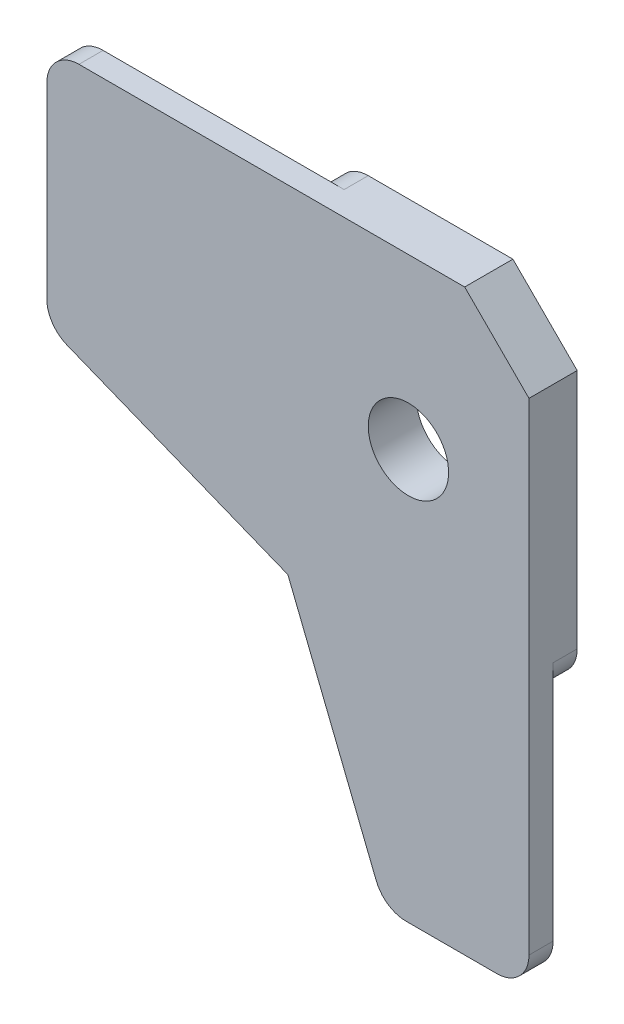
ISO-10303-21;
HEADER;
FILE_DESCRIPTION(('STEP AP214'),'2;1');
FILE_NAME('part.step','',(''),(''),'','','');
FILE_SCHEMA(('AUTOMOTIVE_DESIGN { 1 0 10303 214 1 1 1 1 }'));
ENDSEC;
DATA;
#1=APPLICATION_CONTEXT('core data for automotive mechanical design processes');
#2=APPLICATION_PROTOCOL_DEFINITION('international standard','automotive_design',2000,#1);
#3=PRODUCT_CONTEXT('',#1,'mechanical');
#4=PRODUCT('Part','Part','',(#3));
#5=PRODUCT_RELATED_PRODUCT_CATEGORY('part','',(#4));
#6=PRODUCT_DEFINITION_FORMATION('','',#4);
#7=PRODUCT_DEFINITION_CONTEXT('part definition',#1,'design');
#8=PRODUCT_DEFINITION('design','',#6,#7);
#9=PRODUCT_DEFINITION_SHAPE('','',#8);
#10=(LENGTH_UNIT() NAMED_UNIT(*) SI_UNIT(.MILLI.,.METRE.));
#11=(NAMED_UNIT(*) PLANE_ANGLE_UNIT() SI_UNIT($,.RADIAN.));
#12=(NAMED_UNIT(*) SI_UNIT($,.STERADIAN.) SOLID_ANGLE_UNIT());
#13=UNCERTAINTY_MEASURE_WITH_UNIT(LENGTH_MEASURE(1.E-05),#10,'distance_accuracy_value','');
#14=(GEOMETRIC_REPRESENTATION_CONTEXT(3) GLOBAL_UNCERTAINTY_ASSIGNED_CONTEXT((#13)) GLOBAL_UNIT_ASSIGNED_CONTEXT((#10,
#11,#12)) REPRESENTATION_CONTEXT('',''));
#15=CARTESIAN_POINT('',(0.,0.,0.));
#16=DIRECTION('',(0.,0.,1.));
#17=DIRECTION('',(1.,0.,0.));
#18=AXIS2_PLACEMENT_3D('',#15,#16,#17);
#19=CARTESIAN_POINT('',(0.,0.,-1.5));
#20=DIRECTION('',(1.,0.,0.));
#21=DIRECTION('',(0.,0.,1.));
#22=AXIS2_PLACEMENT_3D('',#19,#20,#21);
#23=PLANE('',#22);
#24=DIRECTION('',(0.,-1.,0.));
#25=VECTOR('',#24,1.);
#26=CARTESIAN_POINT('',(0.,0.,-1.5));
#27=LINE('',#26,#25);
#28=CARTESIAN_POINT('',(0.,19.,-1.5));
#29=VERTEX_POINT('',#28);
#30=CARTESIAN_POINT('',(0.,2.,-1.5));
#31=VERTEX_POINT('',#30);
#32=EDGE_CURVE('E220',#29,#31,#27,.T.);
#33=ORIENTED_EDGE('',*,*,#32,.T.);
#34=DIRECTION('',(0.,0.,1.));
#35=VECTOR('',#34,1.);
#36=CARTESIAN_POINT('',(0.,2.,-1.5));
#37=LINE('',#36,#35);
#38=CARTESIAN_POINT('',(0.,2.,0.));
#39=VERTEX_POINT('',#38);
#40=EDGE_CURVE('E287',#39,#31,#37,.F.);
#41=ORIENTED_EDGE('',*,*,#40,.F.);
#42=DIRECTION('',(0.,-1.,0.));
#43=VECTOR('',#42,1.);
#44=CARTESIAN_POINT('',(0.,0.,0.));
#45=LINE('',#44,#43);
#46=CARTESIAN_POINT('',(0.,19.,0.));
#47=VERTEX_POINT('',#46);
#48=EDGE_CURVE('E181',#47,#39,#45,.T.);
#49=ORIENTED_EDGE('',*,*,#48,.F.);
#50=DIRECTION('',(0.,0.,1.));
#51=VECTOR('',#50,1.);
#52=CARTESIAN_POINT('',(0.,19.,-1.5));
#53=LINE('',#52,#51);
#54=EDGE_CURVE('E289',#29,#47,#53,.T.);
#55=ORIENTED_EDGE('',*,*,#54,.F.);
#56=EDGE_LOOP('',(#33,#41,#49,#55));
#57=FACE_BOUND('',#56,.T.);
#58=ADVANCED_FACE('F41',(#57),#23,.F.);
#59=CARTESIAN_POINT('',(0.,0.,-1.5));
#60=DIRECTION('',(0.,1.,0.));
#61=DIRECTION('',(0.,0.,-1.));
#62=AXIS2_PLACEMENT_3D('',#59,#60,#61);
#63=PLANE('',#62);
#64=DIRECTION('',(1.,0.,0.));
#65=VECTOR('',#64,1.);
#66=CARTESIAN_POINT('',(0.,0.,0.));
#67=LINE('',#66,#65);
#68=CARTESIAN_POINT('',(2.,0.,0.));
#69=VERTEX_POINT('',#68);
#70=CARTESIAN_POINT('',(13.,0.,0.));
#71=VERTEX_POINT('',#70);
#72=EDGE_CURVE('E224',#69,#71,#67,.T.);
#73=ORIENTED_EDGE('',*,*,#72,.F.);
#74=DIRECTION('',(0.,0.,1.));
#75=VECTOR('',#74,1.);
#76=CARTESIAN_POINT('',(2.,0.,-1.5));
#77=LINE('',#76,#75);
#78=CARTESIAN_POINT('',(2.,0.,-1.5));
#79=VERTEX_POINT('',#78);
#80=EDGE_CURVE('E297',#79,#69,#77,.T.);
#81=ORIENTED_EDGE('',*,*,#80,.F.);
#82=DIRECTION('',(1.,0.,0.));
#83=VECTOR('',#82,1.);
#84=CARTESIAN_POINT('',(0.,0.,-1.5));
#85=LINE('',#84,#83);
#86=CARTESIAN_POINT('',(13.,0.,-1.5));
#87=VERTEX_POINT('',#86);
#88=EDGE_CURVE('E223',#79,#87,#85,.T.);
#89=ORIENTED_EDGE('',*,*,#88,.T.);
#90=DIRECTION('',(0.,0.,1.));
#91=VECTOR('',#90,1.);
#92=CARTESIAN_POINT('',(13.,0.,-1.5));
#93=LINE('',#92,#91);
#94=EDGE_CURVE('E299',#71,#87,#93,.F.);
#95=ORIENTED_EDGE('',*,*,#94,.F.);
#96=EDGE_LOOP('',(#73,#81,#89,#95));
#97=FACE_BOUND('',#96,.T.);
#98=ADVANCED_FACE('F310',(#97),#63,.F.);
#99=CARTESIAN_POINT('',(15.,0.,-1.5));
#100=DIRECTION('',(-1.,0.,0.));
#101=DIRECTION('',(0.,0.,-1.));
#102=AXIS2_PLACEMENT_3D('',#99,#100,#101);
#103=PLANE('',#102);
#104=DIRECTION('',(0.,-1.,0.));
#105=VECTOR('',#104,1.);
#106=CARTESIAN_POINT('',(15.,0.,0.));
#107=LINE('',#106,#105);
#108=CARTESIAN_POINT('',(15.,2.,0.));
#109=VERTEX_POINT('',#108);
#110=CARTESIAN_POINT('',(15.,-13.,0.));
#111=VERTEX_POINT('',#110);
#112=EDGE_CURVE('E191',#109,#111,#107,.T.);
#113=ORIENTED_EDGE('',*,*,#112,.F.);
#114=DIRECTION('',(0.,0.,1.));
#115=VECTOR('',#114,1.);
#116=CARTESIAN_POINT('',(15.,2.,-1.5));
#117=LINE('',#116,#115);
#118=CARTESIAN_POINT('',(15.,2.,-1.5));
#119=VERTEX_POINT('',#118);
#120=EDGE_CURVE('E255',#119,#109,#117,.T.);
#121=ORIENTED_EDGE('',*,*,#120,.F.);
#122=DIRECTION('',(0.,1.,0.));
#123=VECTOR('',#122,1.);
#124=CARTESIAN_POINT('',(15.,0.,-1.5));
#125=LINE('',#124,#123);
#126=CARTESIAN_POINT('',(15.,17.,-1.5));
#127=VERTEX_POINT('',#126);
#128=EDGE_CURVE('E227',#119,#127,#125,.T.);
#129=ORIENTED_EDGE('',*,*,#128,.T.);
#130=DIRECTION('',(0.,0.,1.));
#131=VECTOR('',#130,1.);
#132=CARTESIAN_POINT('',(15.,17.,-1.5));
#133=LINE('',#132,#131);
#134=CARTESIAN_POINT('',(15.,17.,1.5));
#135=VERTEX_POINT('',#134);
#136=EDGE_CURVE('E242',#127,#135,#133,.T.);
#137=ORIENTED_EDGE('',*,*,#136,.T.);
#138=DIRECTION('',(0.,-1.,0.));
#139=VECTOR('',#138,1.);
#140=CARTESIAN_POINT('',(15.,17.,1.5));
#141=LINE('',#140,#139);
#142=CARTESIAN_POINT('',(15.,-13.,1.5));
#143=VERTEX_POINT('',#142);
#144=EDGE_CURVE('E203',#135,#143,#141,.T.);
#145=ORIENTED_EDGE('',*,*,#144,.T.);
#146=DIRECTION('',(0.,0.,-1.));
#147=VECTOR('',#146,1.);
#148=CARTESIAN_POINT('',(15.,-13.,-1.5));
#149=LINE('',#148,#147);
#150=EDGE_CURVE('E258',#111,#143,#149,.F.);
#151=ORIENTED_EDGE('',*,*,#150,.F.);
#152=EDGE_LOOP('',(#113,#121,#129,#137,#145,#151));
#153=FACE_BOUND('',#152,.T.);
#154=ADVANCED_FACE('F337',(#153),#103,.F.);
#155=CARTESIAN_POINT('',(11.,21.,-1.5));
#156=DIRECTION('',(-0.707106781186547,-0.707106781186547,0.));
#157=DIRECTION('',(0.707106781186548,-0.707106781186548,0.));
#158=AXIS2_PLACEMENT_3D('',#155,#156,#157);
#159=PLANE('',#158);
#160=ORIENTED_EDGE('',*,*,#136,.F.);
#161=DIRECTION('',(-0.707106781186548,0.707106781186548,0.));
#162=VECTOR('',#161,1.);
#163=CARTESIAN_POINT('',(11.,21.,-1.5));
#164=LINE('',#163,#162);
#165=CARTESIAN_POINT('',(11.,21.,-1.5));
#166=VERTEX_POINT('',#165);
#167=EDGE_CURVE('E230',#127,#166,#164,.T.);
#168=ORIENTED_EDGE('',*,*,#167,.T.);
#169=DIRECTION('',(0.,0.,1.));
#170=VECTOR('',#169,1.);
#171=CARTESIAN_POINT('',(11.,21.,-1.5));
#172=LINE('',#171,#170);
#173=CARTESIAN_POINT('',(11.,21.,1.5));
#174=VERTEX_POINT('',#173);
#175=EDGE_CURVE('E236',#166,#174,#172,.T.);
#176=ORIENTED_EDGE('',*,*,#175,.T.);
#177=DIRECTION('',(0.707106781186548,-0.707106781186548,0.));
#178=VECTOR('',#177,1.);
#179=CARTESIAN_POINT('',(11.,21.,1.5));
#180=LINE('',#179,#178);
#181=EDGE_CURVE('E201',#174,#135,#180,.T.);
#182=ORIENTED_EDGE('',*,*,#181,.T.);
#183=EDGE_LOOP('',(#160,#168,#176,#182));
#184=FACE_BOUND('',#183,.T.);
#185=ADVANCED_FACE('F327',(#184),#159,.F.);
#186=CARTESIAN_POINT('',(0.,21.,-1.5));
#187=DIRECTION('',(0.,-1.,0.));
#188=DIRECTION('',(0.,0.,1.));
#189=AXIS2_PLACEMENT_3D('',#186,#187,#188);
#190=PLANE('',#189);
#191=DIRECTION('',(1.,0.,0.));
#192=VECTOR('',#191,1.);
#193=CARTESIAN_POINT('',(0.,21.,1.5));
#194=LINE('',#193,#192);
#195=CARTESIAN_POINT('',(-13.,21.,1.5));
#196=VERTEX_POINT('',#195);
#197=EDGE_CURVE('E199',#196,#174,#194,.T.);
#198=ORIENTED_EDGE('',*,*,#197,.T.);
#199=ORIENTED_EDGE('',*,*,#175,.F.);
#200=DIRECTION('',(-1.,0.,0.));
#201=VECTOR('',#200,1.);
#202=CARTESIAN_POINT('',(0.,21.,-1.5));
#203=LINE('',#202,#201);
#204=CARTESIAN_POINT('',(2.,21.,-1.5));
#205=VERTEX_POINT('',#204);
#206=EDGE_CURVE('E233',#166,#205,#203,.T.);
#207=ORIENTED_EDGE('',*,*,#206,.T.);
#208=DIRECTION('',(0.,0.,1.));
#209=VECTOR('',#208,1.);
#210=CARTESIAN_POINT('',(2.,21.,-1.5));
#211=LINE('',#210,#209);
#212=CARTESIAN_POINT('',(2.,21.,0.));
#213=VERTEX_POINT('',#212);
#214=EDGE_CURVE('E269',#213,#205,#211,.F.);
#215=ORIENTED_EDGE('',*,*,#214,.F.);
#216=DIRECTION('',(1.,0.,0.));
#217=VECTOR('',#216,1.);
#218=CARTESIAN_POINT('',(0.,21.,0.));
#219=LINE('',#218,#217);
#220=CARTESIAN_POINT('',(-13.,21.,0.));
#221=VERTEX_POINT('',#220);
#222=EDGE_CURVE('E215',#221,#213,#219,.T.);
#223=ORIENTED_EDGE('',*,*,#222,.F.);
#224=DIRECTION('',(0.,0.,-1.));
#225=VECTOR('',#224,1.);
#226=CARTESIAN_POINT('',(-13.,21.,-1.5));
#227=LINE('',#226,#225);
#228=EDGE_CURVE('E272',#196,#221,#227,.T.);
#229=ORIENTED_EDGE('',*,*,#228,.F.);
#230=EDGE_LOOP('',(#198,#199,#207,#215,#223,#229));
#231=FACE_BOUND('',#230,.T.);
#232=ADVANCED_FACE('F319',(#231),#190,.F.);
#233=CARTESIAN_POINT('',(0.,0.,-1.5));
#234=DIRECTION('',(0.,0.,1.));
#235=DIRECTION('',(-1.,0.,0.));
#236=AXIS2_PLACEMENT_3D('',#233,#234,#235);
#237=PLANE('',#236);
#238=CARTESIAN_POINT('',(7.5,10.5,-1.5));
#239=DIRECTION('',(0.,0.,-1.));
#240=DIRECTION('',(-1.,0.,0.));
#241=AXIS2_PLACEMENT_3D('',#238,#239,#240);
#242=CIRCLE('',#241,2.5);
#243=CARTESIAN_POINT('',(5.,10.5,-1.5));
#244=VERTEX_POINT('',#243);
#245=EDGE_CURVE('E210',#244,#244,#242,.T.);
#246=ORIENTED_EDGE('',*,*,#245,.F.);
#247=EDGE_LOOP('',(#246));
#248=FACE_BOUND('',#247,.T.);
#249=ORIENTED_EDGE('',*,*,#206,.F.);
#250=ORIENTED_EDGE('',*,*,#167,.F.);
#251=ORIENTED_EDGE('',*,*,#128,.F.);
#252=CARTESIAN_POINT('',(13.,2.,-1.5));
#253=DIRECTION('',(0.,0.,-1.));
#254=DIRECTION('',(-1.,0.,0.));
#255=AXIS2_PLACEMENT_3D('',#252,#253,#254);
#256=CIRCLE('',#255,2.);
#257=EDGE_CURVE('E62',#87,#119,#256,.F.);
#258=ORIENTED_EDGE('',*,*,#257,.F.);
#259=ORIENTED_EDGE('',*,*,#88,.F.);
#260=CARTESIAN_POINT('',(2.,2.,-1.5));
#261=DIRECTION('',(0.,0.,-1.));
#262=DIRECTION('',(-1.,0.,0.));
#263=AXIS2_PLACEMENT_3D('',#260,#261,#262);
#264=CIRCLE('',#263,2.);
#265=EDGE_CURVE('E292',#31,#79,#264,.F.);
#266=ORIENTED_EDGE('',*,*,#265,.F.);
#267=ORIENTED_EDGE('',*,*,#32,.F.);
#268=CARTESIAN_POINT('',(2.,19.,-1.5));
#269=DIRECTION('',(0.,0.,-1.));
#270=DIRECTION('',(-1.,0.,0.));
#271=AXIS2_PLACEMENT_3D('',#268,#269,#270);
#272=CIRCLE('',#271,2.);
#273=EDGE_CURVE('E295',#205,#29,#272,.F.);
#274=ORIENTED_EDGE('',*,*,#273,.F.);
#275=EDGE_LOOP('',(#249,#250,#251,#258,#259,#266,#267,#274));
#276=FACE_BOUND('',#275,.T.);
#277=ADVANCED_FACE('F316',(#248,#276),#237,.F.);
#278=CARTESIAN_POINT('',(0.,0.,1.5));
#279=DIRECTION('',(0.928476690885259,0.371390676354104,0.));
#280=DIRECTION('',(-0.371390676354104,0.928476690885259,0.));
#281=AXIS2_PLACEMENT_3D('',#278,#279,#280);
#282=PLANE('',#281);
#283=DIRECTION('',(-0.371390676354103,0.928476690885259,0.));
#284=VECTOR('',#283,1.);
#285=CARTESIAN_POINT('',(0.,0.,1.5));
#286=LINE('',#285,#284);
#287=CARTESIAN_POINT('',(5.49711254108328,-13.7427813527082,1.5));
#288=VERTEX_POINT('',#287);
#289=CARTESIAN_POINT('',(0.,0.,1.5));
#290=VERTEX_POINT('',#289);
#291=EDGE_CURVE('E165',#288,#290,#286,.T.);
#292=ORIENTED_EDGE('',*,*,#291,.T.);
#293=DIRECTION('',(0.,0.,-1.));
#294=VECTOR('',#293,1.);
#295=CARTESIAN_POINT('',(0.,0.,1.5));
#296=LINE('',#295,#294);
#297=CARTESIAN_POINT('',(0.,0.,0.));
#298=VERTEX_POINT('',#297);
#299=EDGE_CURVE('E174',#290,#298,#296,.T.);
#300=ORIENTED_EDGE('',*,*,#299,.T.);
#301=DIRECTION('',(-0.371390676354103,0.928476690885259,0.));
#302=VECTOR('',#301,1.);
#303=CARTESIAN_POINT('',(0.,0.,0.));
#304=LINE('',#303,#302);
#305=CARTESIAN_POINT('',(5.49711254108328,-13.7427813527082,0.));
#306=VERTEX_POINT('',#305);
#307=EDGE_CURVE('E208',#306,#298,#304,.T.);
#308=ORIENTED_EDGE('',*,*,#307,.F.);
#309=DIRECTION('',(0.,0.,-1.));
#310=VECTOR('',#309,1.);
#311=CARTESIAN_POINT('',(5.49711254108328,-13.7427813527082,1.5));
#312=LINE('',#311,#310);
#313=EDGE_CURVE('E187',#288,#306,#312,.T.);
#314=ORIENTED_EDGE('',*,*,#313,.F.);
#315=EDGE_LOOP('',(#292,#300,#308,#314));
#316=FACE_BOUND('',#315,.T.);
#317=ADVANCED_FACE('F185',(#316),#282,.F.);
#318=CARTESIAN_POINT('',(0.,0.,1.5));
#319=DIRECTION('',(0.371390676354104,0.928476690885259,0.));
#320=DIRECTION('',(-0.928476690885259,0.371390676354104,0.));
#321=AXIS2_PLACEMENT_3D('',#318,#319,#320);
#322=PLANE('',#321);
#323=DIRECTION('',(-0.928476690885259,0.371390676354104,0.));
#324=VECTOR('',#323,1.);
#325=CARTESIAN_POINT('',(0.,0.,0.));
#326=LINE('',#325,#324);
#327=CARTESIAN_POINT('',(-13.7427813527082,5.49711254108329,0.));
#328=VERTEX_POINT('',#327);
#329=EDGE_CURVE('E177',#298,#328,#326,.T.);
#330=ORIENTED_EDGE('',*,*,#329,.F.);
#331=ORIENTED_EDGE('',*,*,#299,.F.);
#332=DIRECTION('',(-0.928476690885259,0.371390676354104,0.));
#333=VECTOR('',#332,1.);
#334=CARTESIAN_POINT('',(0.,0.,1.5));
#335=LINE('',#334,#333);
#336=CARTESIAN_POINT('',(-13.7427813527082,5.49711254108329,1.5));
#337=VERTEX_POINT('',#336);
#338=EDGE_CURVE('E160',#290,#337,#335,.T.);
#339=ORIENTED_EDGE('',*,*,#338,.T.);
#340=DIRECTION('',(0.,0.,-1.));
#341=VECTOR('',#340,1.);
#342=CARTESIAN_POINT('',(-13.7427813527082,5.49711254108329,1.5));
#343=LINE('',#342,#341);
#344=EDGE_CURVE('E285',#328,#337,#343,.F.);
#345=ORIENTED_EDGE('',*,*,#344,.F.);
#346=EDGE_LOOP('',(#330,#331,#339,#345));
#347=FACE_BOUND('',#346,.T.);
#348=ADVANCED_FACE('F175',(#347),#322,.F.);
#349=CARTESIAN_POINT('',(-15.,21.,1.5));
#350=DIRECTION('',(1.,0.,0.));
#351=DIRECTION('',(0.,1.,0.));
#352=AXIS2_PLACEMENT_3D('',#349,#350,#351);
#353=PLANE('',#352);
#354=DIRECTION('',(0.,1.,0.));
#355=VECTOR('',#354,1.);
#356=CARTESIAN_POINT('',(-15.,21.,0.));
#357=LINE('',#356,#355);
#358=CARTESIAN_POINT('',(-15.,7.35406592285381,0.));
#359=VERTEX_POINT('',#358);
#360=CARTESIAN_POINT('',(-15.,19.,0.));
#361=VERTEX_POINT('',#360);
#362=EDGE_CURVE('E212',#359,#361,#357,.T.);
#363=ORIENTED_EDGE('',*,*,#362,.F.);
#364=DIRECTION('',(0.,0.,-1.));
#365=VECTOR('',#364,1.);
#366=CARTESIAN_POINT('',(-15.,7.35406592285381,1.5));
#367=LINE('',#366,#365);
#368=CARTESIAN_POINT('',(-15.,7.35406592285381,1.5));
#369=VERTEX_POINT('',#368);
#370=EDGE_CURVE('E279',#369,#359,#367,.T.);
#371=ORIENTED_EDGE('',*,*,#370,.F.);
#372=DIRECTION('',(0.,1.,0.));
#373=VECTOR('',#372,1.);
#374=CARTESIAN_POINT('',(-15.,21.,1.5));
#375=LINE('',#374,#373);
#376=CARTESIAN_POINT('',(-15.,19.,1.5));
#377=VERTEX_POINT('',#376);
#378=EDGE_CURVE('E171',#369,#377,#375,.T.);
#379=ORIENTED_EDGE('',*,*,#378,.T.);
#380=DIRECTION('',(0.,0.,-1.));
#381=VECTOR('',#380,1.);
#382=CARTESIAN_POINT('',(-15.,19.,1.5));
#383=LINE('',#382,#381);
#384=EDGE_CURVE('E282',#361,#377,#383,.F.);
#385=ORIENTED_EDGE('',*,*,#384,.F.);
#386=EDGE_LOOP('',(#363,#371,#379,#385));
#387=FACE_BOUND('',#386,.T.);
#388=ADVANCED_FACE('F383',(#387),#353,.F.);
#389=CARTESIAN_POINT('',(15.,-15.,1.5));
#390=DIRECTION('',(0.,1.,0.));
#391=DIRECTION('',(0.,0.,-1.));
#392=AXIS2_PLACEMENT_3D('',#389,#390,#391);
#393=PLANE('',#392);
#394=DIRECTION('',(-1.,0.,0.));
#395=VECTOR('',#394,1.);
#396=CARTESIAN_POINT('',(15.,-15.,1.5));
#397=LINE('',#396,#395);
#398=CARTESIAN_POINT('',(13.,-15.,1.5));
#399=VERTEX_POINT('',#398);
#400=CARTESIAN_POINT('',(7.3540659228538,-15.,1.5));
#401=VERTEX_POINT('',#400);
#402=EDGE_CURVE('E182',#399,#401,#397,.T.);
#403=ORIENTED_EDGE('',*,*,#402,.T.);
#404=DIRECTION('',(0.,0.,-1.));
#405=VECTOR('',#404,1.);
#406=CARTESIAN_POINT('',(7.3540659228538,-15.,1.5));
#407=LINE('',#406,#405);
#408=CARTESIAN_POINT('',(7.3540659228538,-15.,0.));
#409=VERTEX_POINT('',#408);
#410=EDGE_CURVE('E245',#409,#401,#407,.F.);
#411=ORIENTED_EDGE('',*,*,#410,.F.);
#412=DIRECTION('',(-1.,0.,0.));
#413=VECTOR('',#412,1.);
#414=CARTESIAN_POINT('',(15.,-15.,0.));
#415=LINE('',#414,#413);
#416=CARTESIAN_POINT('',(13.,-15.,0.));
#417=VERTEX_POINT('',#416);
#418=EDGE_CURVE('E188',#417,#409,#415,.T.);
#419=ORIENTED_EDGE('',*,*,#418,.F.);
#420=DIRECTION('',(0.,0.,-1.));
#421=VECTOR('',#420,1.);
#422=CARTESIAN_POINT('',(13.,-15.,1.5));
#423=LINE('',#422,#421);
#424=EDGE_CURVE('E248',#399,#417,#423,.T.);
#425=ORIENTED_EDGE('',*,*,#424,.F.);
#426=EDGE_LOOP('',(#403,#411,#419,#425));
#427=FACE_BOUND('',#426,.T.);
#428=ADVANCED_FACE('F377',(#427),#393,.F.);
#429=CARTESIAN_POINT('',(0.,0.,1.5));
#430=DIRECTION('',(0.,0.,1.));
#431=DIRECTION('',(-1.,0.,0.));
#432=AXIS2_PLACEMENT_3D('',#429,#430,#431);
#433=PLANE('',#432);
#434=CARTESIAN_POINT('',(7.5,10.5,1.5));
#435=DIRECTION('',(0.,0.,-1.));
#436=DIRECTION('',(-1.,0.,0.));
#437=AXIS2_PLACEMENT_3D('',#434,#435,#436);
#438=CIRCLE('',#437,2.5);
#439=CARTESIAN_POINT('',(5.,10.5,1.5));
#440=VERTEX_POINT('',#439);
#441=EDGE_CURVE('E194',#440,#440,#438,.T.);
#442=ORIENTED_EDGE('',*,*,#441,.T.);
#443=EDGE_LOOP('',(#442));
#444=FACE_BOUND('',#443,.T.);
#445=ORIENTED_EDGE('',*,*,#144,.F.);
#446=ORIENTED_EDGE('',*,*,#181,.F.);
#447=ORIENTED_EDGE('',*,*,#197,.F.);
#448=CARTESIAN_POINT('',(-13.,19.,1.5));
#449=DIRECTION('',(0.,0.,-1.));
#450=DIRECTION('',(-1.,0.,0.));
#451=AXIS2_PLACEMENT_3D('',#448,#449,#450);
#452=CIRCLE('',#451,2.);
#453=EDGE_CURVE('E262',#377,#196,#452,.T.);
#454=ORIENTED_EDGE('',*,*,#453,.F.);
#455=ORIENTED_EDGE('',*,*,#378,.F.);
#456=CARTESIAN_POINT('',(-13.,7.35406592285381,1.5));
#457=DIRECTION('',(0.,0.,-1.));
#458=DIRECTION('',(-1.,0.,0.));
#459=AXIS2_PLACEMENT_3D('',#456,#457,#458);
#460=CIRCLE('',#459,2.);
#461=EDGE_CURVE('E167',#337,#369,#460,.T.);
#462=ORIENTED_EDGE('',*,*,#461,.F.);
#463=ORIENTED_EDGE('',*,*,#338,.F.);
#464=ORIENTED_EDGE('',*,*,#291,.F.);
#465=CARTESIAN_POINT('',(7.3540659228538,-13.,1.5));
#466=DIRECTION('',(0.,0.,-1.));
#467=DIRECTION('',(-1.,0.,0.));
#468=AXIS2_PLACEMENT_3D('',#465,#466,#467);
#469=CIRCLE('',#468,2.);
#470=EDGE_CURVE('E264',#401,#288,#469,.T.);
#471=ORIENTED_EDGE('',*,*,#470,.F.);
#472=ORIENTED_EDGE('',*,*,#402,.F.);
#473=CARTESIAN_POINT('',(13.,-13.,1.5));
#474=DIRECTION('',(0.,0.,-1.));
#475=DIRECTION('',(-1.,0.,0.));
#476=AXIS2_PLACEMENT_3D('',#473,#474,#475);
#477=CIRCLE('',#476,2.);
#478=EDGE_CURVE('E266',#143,#399,#477,.T.);
#479=ORIENTED_EDGE('',*,*,#478,.F.);
#480=EDGE_LOOP('',(#445,#446,#447,#454,#455,#462,#463,#464,#471,#472,#479));
#481=FACE_BOUND('',#480,.T.);
#482=ADVANCED_FACE('F163',(#444,#481),#433,.T.);
#483=CARTESIAN_POINT('',(0.,0.,0.));
#484=DIRECTION('',(0.,0.,1.));
#485=DIRECTION('',(-1.,0.,0.));
#486=AXIS2_PLACEMENT_3D('',#483,#484,#485);
#487=PLANE('',#486);
#488=ORIENTED_EDGE('',*,*,#418,.T.);
#489=CARTESIAN_POINT('',(7.3540659228538,-13.,0.));
#490=DIRECTION('',(0.,0.,-1.));
#491=DIRECTION('',(-1.,0.,0.));
#492=AXIS2_PLACEMENT_3D('',#489,#490,#491);
#493=CIRCLE('',#492,2.);
#494=EDGE_CURVE('E251',#306,#409,#493,.F.);
#495=ORIENTED_EDGE('',*,*,#494,.F.);
#496=ORIENTED_EDGE('',*,*,#307,.T.);
#497=ORIENTED_EDGE('',*,*,#329,.T.);
#498=CARTESIAN_POINT('',(-13.,7.35406592285381,0.));
#499=DIRECTION('',(0.,0.,-1.));
#500=DIRECTION('',(-1.,0.,0.));
#501=AXIS2_PLACEMENT_3D('',#498,#499,#500);
#502=CIRCLE('',#501,2.);
#503=EDGE_CURVE('E275',#359,#328,#502,.F.);
#504=ORIENTED_EDGE('',*,*,#503,.F.);
#505=ORIENTED_EDGE('',*,*,#362,.T.);
#506=CARTESIAN_POINT('',(-13.,19.,0.));
#507=DIRECTION('',(0.,0.,-1.));
#508=DIRECTION('',(-1.,0.,0.));
#509=AXIS2_PLACEMENT_3D('',#506,#507,#508);
#510=CIRCLE('',#509,2.);
#511=EDGE_CURVE('E277',#221,#361,#510,.F.);
#512=ORIENTED_EDGE('',*,*,#511,.F.);
#513=ORIENTED_EDGE('',*,*,#222,.T.);
#514=CARTESIAN_POINT('',(2.,19.,0.));
#515=DIRECTION('',(0.,0.,-1.));
#516=DIRECTION('',(-1.,0.,0.));
#517=AXIS2_PLACEMENT_3D('',#514,#515,#516);
#518=CIRCLE('',#517,2.);
#519=EDGE_CURVE('E301',#47,#213,#518,.T.);
#520=ORIENTED_EDGE('',*,*,#519,.F.);
#521=ORIENTED_EDGE('',*,*,#48,.T.);
#522=CARTESIAN_POINT('',(2.,2.,0.));
#523=DIRECTION('',(0.,0.,-1.));
#524=DIRECTION('',(-1.,0.,0.));
#525=AXIS2_PLACEMENT_3D('',#522,#523,#524);
#526=CIRCLE('',#525,2.);
#527=EDGE_CURVE('E11',#69,#39,#526,.T.);
#528=ORIENTED_EDGE('',*,*,#527,.F.);
#529=ORIENTED_EDGE('',*,*,#72,.T.);
#530=CARTESIAN_POINT('',(13.,2.,0.));
#531=DIRECTION('',(0.,0.,-1.));
#532=DIRECTION('',(-1.,0.,0.));
#533=AXIS2_PLACEMENT_3D('',#530,#531,#532);
#534=CIRCLE('',#533,2.);
#535=EDGE_CURVE('E49',#109,#71,#534,.T.);
#536=ORIENTED_EDGE('',*,*,#535,.F.);
#537=ORIENTED_EDGE('',*,*,#112,.T.);
#538=CARTESIAN_POINT('',(13.,-13.,0.));
#539=DIRECTION('',(0.,0.,-1.));
#540=DIRECTION('',(-1.,0.,0.));
#541=AXIS2_PLACEMENT_3D('',#538,#539,#540);
#542=CIRCLE('',#541,2.);
#543=EDGE_CURVE('E253',#417,#111,#542,.F.);
#544=ORIENTED_EDGE('',*,*,#543,.F.);
#545=EDGE_LOOP('',(#488,#495,#496,#497,#504,#505,#512,#513,#520,#521,#528,#529,#536,#537,#544));
#546=FACE_BOUND('',#545,.T.);
#547=ADVANCED_FACE('F312',(#546),#487,.F.);
#548=CARTESIAN_POINT('',(13.,-13.,1.5));
#549=DIRECTION('',(0.,0.,-1.));
#550=DIRECTION('',(1.,0.,0.));
#551=AXIS2_PLACEMENT_3D('',#548,#549,#550);
#552=CYLINDRICAL_SURFACE('',#551,2.);
#553=ORIENTED_EDGE('',*,*,#478,.T.);
#554=ORIENTED_EDGE('',*,*,#424,.T.);
#555=ORIENTED_EDGE('',*,*,#543,.T.);
#556=ORIENTED_EDGE('',*,*,#150,.T.);
#557=EDGE_LOOP('',(#553,#554,#555,#556));
#558=FACE_BOUND('',#557,.T.);
#559=ADVANCED_FACE('F341',(#558),#552,.T.);
#560=CARTESIAN_POINT('',(7.3540659228538,-13.,1.5));
#561=DIRECTION('',(0.,0.,-1.));
#562=DIRECTION('',(1.,0.,0.));
#563=AXIS2_PLACEMENT_3D('',#560,#561,#562);
#564=CYLINDRICAL_SURFACE('',#563,2.);
#565=ORIENTED_EDGE('',*,*,#470,.T.);
#566=ORIENTED_EDGE('',*,*,#313,.T.);
#567=ORIENTED_EDGE('',*,*,#494,.T.);
#568=ORIENTED_EDGE('',*,*,#410,.T.);
#569=EDGE_LOOP('',(#565,#566,#567,#568));
#570=FACE_BOUND('',#569,.T.);
#571=ADVANCED_FACE('F344',(#570),#564,.T.);
#572=CARTESIAN_POINT('',(-13.,19.,-1.5));
#573=DIRECTION('',(0.,0.,-1.));
#574=DIRECTION('',(1.,0.,0.));
#575=AXIS2_PLACEMENT_3D('',#572,#573,#574);
#576=CYLINDRICAL_SURFACE('',#575,2.);
#577=ORIENTED_EDGE('',*,*,#453,.T.);
#578=ORIENTED_EDGE('',*,*,#228,.T.);
#579=ORIENTED_EDGE('',*,*,#511,.T.);
#580=ORIENTED_EDGE('',*,*,#384,.T.);
#581=EDGE_LOOP('',(#577,#578,#579,#580));
#582=FACE_BOUND('',#581,.T.);
#583=ADVANCED_FACE('F348',(#582),#576,.T.);
#584=CARTESIAN_POINT('',(-13.,7.35406592285381,1.5));
#585=DIRECTION('',(0.,0.,-1.));
#586=DIRECTION('',(1.,0.,0.));
#587=AXIS2_PLACEMENT_3D('',#584,#585,#586);
#588=CYLINDRICAL_SURFACE('',#587,2.);
#589=ORIENTED_EDGE('',*,*,#461,.T.);
#590=ORIENTED_EDGE('',*,*,#370,.T.);
#591=ORIENTED_EDGE('',*,*,#503,.T.);
#592=ORIENTED_EDGE('',*,*,#344,.T.);
#593=EDGE_LOOP('',(#589,#590,#591,#592));
#594=FACE_BOUND('',#593,.T.);
#595=ADVANCED_FACE('F352',(#594),#588,.T.);
#596=CARTESIAN_POINT('',(2.,19.,-1.5));
#597=DIRECTION('',(0.,0.,1.));
#598=DIRECTION('',(-1.,0.,0.));
#599=AXIS2_PLACEMENT_3D('',#596,#597,#598);
#600=CYLINDRICAL_SURFACE('',#599,2.);
#601=ORIENTED_EDGE('',*,*,#273,.T.);
#602=ORIENTED_EDGE('',*,*,#54,.T.);
#603=ORIENTED_EDGE('',*,*,#519,.T.);
#604=ORIENTED_EDGE('',*,*,#214,.T.);
#605=EDGE_LOOP('',(#601,#602,#603,#604));
#606=FACE_BOUND('',#605,.T.);
#607=ADVANCED_FACE('F356',(#606),#600,.T.);
#608=CARTESIAN_POINT('',(13.,2.,-1.5));
#609=DIRECTION('',(0.,0.,1.));
#610=DIRECTION('',(-1.,0.,0.));
#611=AXIS2_PLACEMENT_3D('',#608,#609,#610);
#612=CYLINDRICAL_SURFACE('',#611,2.);
#613=ORIENTED_EDGE('',*,*,#257,.T.);
#614=ORIENTED_EDGE('',*,*,#120,.T.);
#615=ORIENTED_EDGE('',*,*,#535,.T.);
#616=ORIENTED_EDGE('',*,*,#94,.T.);
#617=EDGE_LOOP('',(#613,#614,#615,#616));
#618=FACE_BOUND('',#617,.T.);
#619=ADVANCED_FACE('F304',(#618),#612,.T.);
#620=CARTESIAN_POINT('',(2.,2.,-1.5));
#621=DIRECTION('',(0.,0.,1.));
#622=DIRECTION('',(-1.,0.,0.));
#623=AXIS2_PLACEMENT_3D('',#620,#621,#622);
#624=CYLINDRICAL_SURFACE('',#623,2.);
#625=ORIENTED_EDGE('',*,*,#265,.T.);
#626=ORIENTED_EDGE('',*,*,#80,.T.);
#627=ORIENTED_EDGE('',*,*,#527,.T.);
#628=ORIENTED_EDGE('',*,*,#40,.T.);
#629=EDGE_LOOP('',(#625,#626,#627,#628));
#630=FACE_BOUND('',#629,.T.);
#631=ADVANCED_FACE('F43',(#630),#624,.T.);
#632=CARTESIAN_POINT('',(7.5,10.5,-1.5));
#633=DIRECTION('',(0.,0.,1.));
#634=DIRECTION('',(-1.,0.,0.));
#635=AXIS2_PLACEMENT_3D('',#632,#633,#634);
#636=CYLINDRICAL_SURFACE('',#635,2.5);
#637=ORIENTED_EDGE('',*,*,#245,.T.);
#638=EDGE_LOOP('',(#637));
#639=FACE_BOUND('',#638,.T.);
#640=ORIENTED_EDGE('',*,*,#441,.F.);
#641=EDGE_LOOP('',(#640));
#642=FACE_BOUND('',#641,.T.);
#643=ADVANCED_FACE('F364',(#639,#642),#636,.F.);
#644=CLOSED_SHELL('',(#58,#98,#154,#185,#232,#277,#317,#348,#388,#428,#482,#547,#559,#571,#583,
#595,#607,#619,#631,#643));
#645=MANIFOLD_SOLID_BREP('B2',#644);
#646=ADVANCED_BREP_SHAPE_REPRESENTATION('',(#18,#645),#14);
#647=SHAPE_DEFINITION_REPRESENTATION(#9,#646);
ENDSEC;
END-ISO-10303-21;
